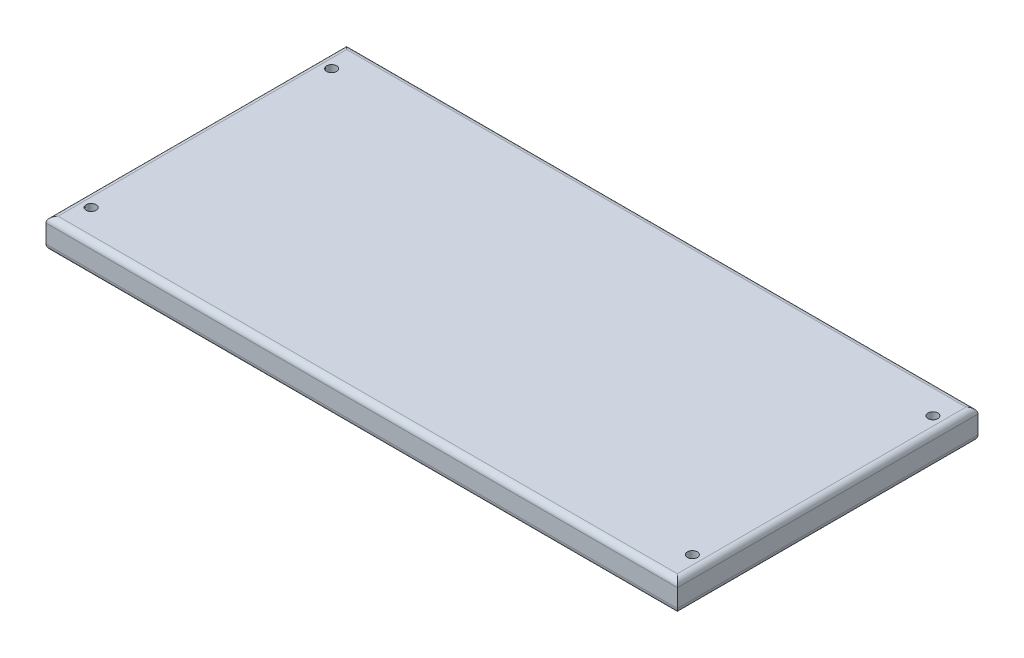
ISO-10303-21;
HEADER;
FILE_DESCRIPTION(('STEP AP214'),'2;1');
FILE_NAME('part.step','',(''),(''),'','','');
FILE_SCHEMA(('AUTOMOTIVE_DESIGN { 1 0 10303 214 1 1 1 1 }'));
ENDSEC;
DATA;
#1=APPLICATION_CONTEXT('core data for automotive mechanical design processes');
#2=APPLICATION_PROTOCOL_DEFINITION('international standard','automotive_design',2000,#1);
#3=PRODUCT_CONTEXT('',#1,'mechanical');
#4=PRODUCT('Part','Part','',(#3));
#5=PRODUCT_RELATED_PRODUCT_CATEGORY('part','',(#4));
#6=PRODUCT_DEFINITION_FORMATION('','',#4);
#7=PRODUCT_DEFINITION_CONTEXT('part definition',#1,'design');
#8=PRODUCT_DEFINITION('design','',#6,#7);
#9=PRODUCT_DEFINITION_SHAPE('','',#8);
#10=(LENGTH_UNIT() NAMED_UNIT(*) SI_UNIT(.MILLI.,.METRE.));
#11=(NAMED_UNIT(*) PLANE_ANGLE_UNIT() SI_UNIT($,.RADIAN.));
#12=(NAMED_UNIT(*) SI_UNIT($,.STERADIAN.) SOLID_ANGLE_UNIT());
#13=UNCERTAINTY_MEASURE_WITH_UNIT(LENGTH_MEASURE(1.E-05),#10,'distance_accuracy_value','');
#14=(GEOMETRIC_REPRESENTATION_CONTEXT(3) GLOBAL_UNCERTAINTY_ASSIGNED_CONTEXT((#13)) GLOBAL_UNIT_ASSIGNED_CONTEXT((#10,
#11,#12)) REPRESENTATION_CONTEXT('',''));
#15=CARTESIAN_POINT('',(0.,0.,0.));
#16=DIRECTION('',(0.,0.,1.));
#17=DIRECTION('',(1.,0.,0.));
#18=AXIS2_PLACEMENT_3D('',#15,#16,#17);
#19=CARTESIAN_POINT('',(-210.,10.,-100.));
#20=DIRECTION('',(1.,0.,0.));
#21=DIRECTION('',(0.,0.,-1.));
#22=AXIS2_PLACEMENT_3D('',#19,#20,#21);
#23=PLANE('',#22);
#24=DIRECTION('',(0.,-1.,0.));
#25=VECTOR('',#24,1.);
#26=CARTESIAN_POINT('',(-210.,10.,-100.));
#27=LINE('',#26,#25);
#28=CARTESIAN_POINT('',(-210.,8.,-100.));
#29=VERTEX_POINT('',#28);
#30=CARTESIAN_POINT('',(-210.,2.,-100.));
#31=VERTEX_POINT('',#30);
#32=EDGE_CURVE('E151',#29,#31,#27,.T.);
#33=ORIENTED_EDGE('',*,*,#32,.T.);
#34=DIRECTION('',(0.,0.,1.));
#35=VECTOR('',#34,1.);
#36=CARTESIAN_POINT('',(-210.,2.,-100.));
#37=LINE('',#36,#35);
#38=CARTESIAN_POINT('',(-210.,2.,0.));
#39=VERTEX_POINT('',#38);
#40=EDGE_CURVE('E160',#31,#39,#37,.T.);
#41=ORIENTED_EDGE('',*,*,#40,.T.);
#42=DIRECTION('',(0.,-1.,0.));
#43=VECTOR('',#42,1.);
#44=CARTESIAN_POINT('',(-210.,10.,0.));
#45=LINE('',#44,#43);
#46=CARTESIAN_POINT('',(-210.,8.,0.));
#47=VERTEX_POINT('',#46);
#48=EDGE_CURVE('E128',#47,#39,#45,.T.);
#49=ORIENTED_EDGE('',*,*,#48,.F.);
#50=DIRECTION('',(0.,0.,1.));
#51=VECTOR('',#50,1.);
#52=CARTESIAN_POINT('',(-210.,8.,-100.));
#53=LINE('',#52,#51);
#54=EDGE_CURVE('E162',#47,#29,#53,.F.);
#55=ORIENTED_EDGE('',*,*,#54,.T.);
#56=EDGE_LOOP('',(#33,#41,#49,#55));
#57=FACE_BOUND('',#56,.T.);
#58=ADVANCED_FACE('F41',(#57),#23,.F.);
#59=CARTESIAN_POINT('',(-210.,10.,0.));
#60=DIRECTION('',(0.,0.,-1.));
#61=DIRECTION('',(-1.,0.,0.));
#62=AXIS2_PLACEMENT_3D('',#59,#60,#61);
#63=PLANE('',#62);
#64=ORIENTED_EDGE('',*,*,#48,.T.);
#65=DIRECTION('',(1.,0.,0.));
#66=VECTOR('',#65,1.);
#67=CARTESIAN_POINT('',(-210.,2.,0.));
#68=LINE('',#67,#66);
#69=CARTESIAN_POINT('',(0.,2.,0.));
#70=VERTEX_POINT('',#69);
#71=EDGE_CURVE('E127',#39,#70,#68,.T.);
#72=ORIENTED_EDGE('',*,*,#71,.T.);
#73=DIRECTION('',(0.,-1.,0.));
#74=VECTOR('',#73,1.);
#75=CARTESIAN_POINT('',(0.,10.,0.));
#76=LINE('',#75,#74);
#77=CARTESIAN_POINT('',(0.,8.,0.));
#78=VERTEX_POINT('',#77);
#79=EDGE_CURVE('E110',#78,#70,#76,.T.);
#80=ORIENTED_EDGE('',*,*,#79,.F.);
#81=DIRECTION('',(1.,0.,0.));
#82=VECTOR('',#81,1.);
#83=CARTESIAN_POINT('',(-210.,8.,0.));
#84=LINE('',#83,#82);
#85=EDGE_CURVE('E124',#78,#47,#84,.F.);
#86=ORIENTED_EDGE('',*,*,#85,.T.);
#87=EDGE_LOOP('',(#64,#72,#80,#86));
#88=FACE_BOUND('',#87,.T.);
#89=ADVANCED_FACE('F123',(#88),#63,.F.);
#90=CARTESIAN_POINT('',(0.,10.,-100.));
#91=DIRECTION('',(-1.,0.,0.));
#92=DIRECTION('',(0.,0.,1.));
#93=AXIS2_PLACEMENT_3D('',#90,#91,#92);
#94=PLANE('',#93);
#95=ORIENTED_EDGE('',*,*,#79,.T.);
#96=DIRECTION('',(0.,0.,-1.));
#97=VECTOR('',#96,1.);
#98=CARTESIAN_POINT('',(0.,2.,-100.));
#99=LINE('',#98,#97);
#100=CARTESIAN_POINT('',(0.,2.,-100.));
#101=VERTEX_POINT('',#100);
#102=EDGE_CURVE('E116',#70,#101,#99,.T.);
#103=ORIENTED_EDGE('',*,*,#102,.T.);
#104=DIRECTION('',(0.,-1.,0.));
#105=VECTOR('',#104,1.);
#106=CARTESIAN_POINT('',(0.,10.,-100.));
#107=LINE('',#106,#105);
#108=CARTESIAN_POINT('',(0.,8.,-100.));
#109=VERTEX_POINT('',#108);
#110=EDGE_CURVE('E112',#109,#101,#107,.T.);
#111=ORIENTED_EDGE('',*,*,#110,.F.);
#112=DIRECTION('',(0.,0.,-1.));
#113=VECTOR('',#112,1.);
#114=CARTESIAN_POINT('',(0.,8.,0.));
#115=LINE('',#114,#113);
#116=EDGE_CURVE('E107',#109,#78,#115,.F.);
#117=ORIENTED_EDGE('',*,*,#116,.T.);
#118=EDGE_LOOP('',(#95,#103,#111,#117));
#119=FACE_BOUND('',#118,.T.);
#120=ADVANCED_FACE('F109',(#119),#94,.F.);
#121=CARTESIAN_POINT('',(-210.,10.,-100.));
#122=DIRECTION('',(0.,0.,1.));
#123=DIRECTION('',(1.,0.,0.));
#124=AXIS2_PLACEMENT_3D('',#121,#122,#123);
#125=PLANE('',#124);
#126=ORIENTED_EDGE('',*,*,#110,.T.);
#127=DIRECTION('',(-1.,0.,0.));
#128=VECTOR('',#127,1.);
#129=CARTESIAN_POINT('',(-210.,2.,-100.));
#130=LINE('',#129,#128);
#131=EDGE_CURVE('E164',#101,#31,#130,.T.);
#132=ORIENTED_EDGE('',*,*,#131,.T.);
#133=ORIENTED_EDGE('',*,*,#32,.F.);
#134=DIRECTION('',(-1.,0.,0.));
#135=VECTOR('',#134,1.);
#136=CARTESIAN_POINT('',(0.,8.,-100.));
#137=LINE('',#136,#135);
#138=EDGE_CURVE('E166',#29,#109,#137,.F.);
#139=ORIENTED_EDGE('',*,*,#138,.T.);
#140=EDGE_LOOP('',(#126,#132,#133,#139));
#141=FACE_BOUND('',#140,.T.);
#142=ADVANCED_FACE('F212',(#141),#125,.F.);
#143=CARTESIAN_POINT('',(0.,10.,0.));
#144=DIRECTION('',(0.,1.,0.));
#145=DIRECTION('',(0.,0.,1.));
#146=AXIS2_PLACEMENT_3D('',#143,#144,#145);
#147=PLANE('',#146);
#148=CARTESIAN_POINT('',(-4.99999999999995,10.,-9.99999999999998));
#149=DIRECTION('',(0.,1.,0.));
#150=DIRECTION('',(0.,0.,1.));
#151=AXIS2_PLACEMENT_3D('',#148,#149,#150);
#152=CIRCLE('',#151,1.65000000000001);
#153=CARTESIAN_POINT('',(-4.99999999999995,10.,-8.34999999999997));
#154=VERTEX_POINT('',#153);
#155=EDGE_CURVE('E191',#154,#154,#152,.T.);
#156=ORIENTED_EDGE('',*,*,#155,.F.);
#157=EDGE_LOOP('',(#156));
#158=FACE_BOUND('',#157,.T.);
#159=CARTESIAN_POINT('',(-4.99999999999995,10.,-90.));
#160=DIRECTION('',(0.,1.,0.));
#161=DIRECTION('',(0.,0.,1.));
#162=AXIS2_PLACEMENT_3D('',#159,#160,#161);
#163=CIRCLE('',#162,1.65000000000001);
#164=CARTESIAN_POINT('',(-4.99999999999995,10.,-88.35));
#165=VERTEX_POINT('',#164);
#166=EDGE_CURVE('E197',#165,#165,#163,.T.);
#167=ORIENTED_EDGE('',*,*,#166,.F.);
#168=EDGE_LOOP('',(#167));
#169=FACE_BOUND('',#168,.T.);
#170=CARTESIAN_POINT('',(-205.,10.,-90.));
#171=DIRECTION('',(0.,1.,0.));
#172=DIRECTION('',(0.,0.,1.));
#173=AXIS2_PLACEMENT_3D('',#170,#171,#172);
#174=CIRCLE('',#173,1.64999999999999);
#175=CARTESIAN_POINT('',(-205.,10.,-88.35));
#176=VERTEX_POINT('',#175);
#177=EDGE_CURVE('E185',#176,#176,#174,.T.);
#178=ORIENTED_EDGE('',*,*,#177,.F.);
#179=EDGE_LOOP('',(#178));
#180=FACE_BOUND('',#179,.T.);
#181=CARTESIAN_POINT('',(-205.,10.,-9.99999999999998));
#182=DIRECTION('',(0.,1.,0.));
#183=DIRECTION('',(0.,0.,1.));
#184=AXIS2_PLACEMENT_3D('',#181,#182,#183);
#185=CIRCLE('',#184,1.65000000000002);
#186=CARTESIAN_POINT('',(-205.,10.,-8.34999999999997));
#187=VERTEX_POINT('',#186);
#188=EDGE_CURVE('E182',#187,#187,#185,.T.);
#189=ORIENTED_EDGE('',*,*,#188,.F.);
#190=EDGE_LOOP('',(#189));
#191=FACE_BOUND('',#190,.T.);
#192=DIRECTION('',(0.,0.,-1.));
#193=VECTOR('',#192,1.);
#194=CARTESIAN_POINT('',(-2.,10.,-100.));
#195=LINE('',#194,#193);
#196=CARTESIAN_POINT('',(-2.,10.,-2.));
#197=VERTEX_POINT('',#196);
#198=CARTESIAN_POINT('',(-2.,10.,-98.));
#199=VERTEX_POINT('',#198);
#200=EDGE_CURVE('E50',#197,#199,#195,.T.);
#201=ORIENTED_EDGE('',*,*,#200,.T.);
#202=DIRECTION('',(-1.,0.,0.));
#203=VECTOR('',#202,1.);
#204=CARTESIAN_POINT('',(-210.,10.,-98.));
#205=LINE('',#204,#203);
#206=CARTESIAN_POINT('',(-208.,10.,-98.));
#207=VERTEX_POINT('',#206);
#208=EDGE_CURVE('E11',#199,#207,#205,.T.);
#209=ORIENTED_EDGE('',*,*,#208,.T.);
#210=DIRECTION('',(0.,0.,1.));
#211=VECTOR('',#210,1.);
#212=CARTESIAN_POINT('',(-208.,10.,0.));
#213=LINE('',#212,#211);
#214=CARTESIAN_POINT('',(-208.,10.,-2.));
#215=VERTEX_POINT('',#214);
#216=EDGE_CURVE('E158',#207,#215,#213,.T.);
#217=ORIENTED_EDGE('',*,*,#216,.T.);
#218=DIRECTION('',(1.,0.,0.));
#219=VECTOR('',#218,1.);
#220=CARTESIAN_POINT('',(0.,10.,-2.));
#221=LINE('',#220,#219);
#222=EDGE_CURVE('E61',#215,#197,#221,.T.);
#223=ORIENTED_EDGE('',*,*,#222,.T.);
#224=EDGE_LOOP('',(#201,#209,#217,#223));
#225=FACE_BOUND('',#224,.T.);
#226=ADVANCED_FACE('F208',(#158,#169,#180,#191,#225),#147,.T.);
#227=CARTESIAN_POINT('',(0.,0.,0.));
#228=DIRECTION('',(0.,1.,0.));
#229=DIRECTION('',(0.,0.,1.));
#230=AXIS2_PLACEMENT_3D('',#227,#228,#229);
#231=PLANE('',#230);
#232=CARTESIAN_POINT('',(-4.99999999999995,0.,-9.99999999999998));
#233=DIRECTION('',(0.,1.,0.));
#234=DIRECTION('',(0.,0.,1.));
#235=AXIS2_PLACEMENT_3D('',#232,#233,#234);
#236=CIRCLE('',#235,1.65000000000001);
#237=CARTESIAN_POINT('',(-4.99999999999995,0.,-8.34999999999997));
#238=VERTEX_POINT('',#237);
#239=EDGE_CURVE('E188',#238,#238,#236,.T.);
#240=ORIENTED_EDGE('',*,*,#239,.T.);
#241=EDGE_LOOP('',(#240));
#242=FACE_BOUND('',#241,.T.);
#243=CARTESIAN_POINT('',(-4.99999999999995,0.,-90.));
#244=DIRECTION('',(0.,1.,0.));
#245=DIRECTION('',(0.,0.,1.));
#246=AXIS2_PLACEMENT_3D('',#243,#244,#245);
#247=CIRCLE('',#246,1.65000000000001);
#248=CARTESIAN_POINT('',(-4.99999999999995,0.,-88.35));
#249=VERTEX_POINT('',#248);
#250=EDGE_CURVE('E194',#249,#249,#247,.T.);
#251=ORIENTED_EDGE('',*,*,#250,.T.);
#252=EDGE_LOOP('',(#251));
#253=FACE_BOUND('',#252,.T.);
#254=CARTESIAN_POINT('',(-205.,0.,-90.));
#255=DIRECTION('',(0.,1.,0.));
#256=DIRECTION('',(0.,0.,1.));
#257=AXIS2_PLACEMENT_3D('',#254,#255,#256);
#258=CIRCLE('',#257,1.64999999999999);
#259=CARTESIAN_POINT('',(-205.,0.,-88.35));
#260=VERTEX_POINT('',#259);
#261=EDGE_CURVE('E200',#260,#260,#258,.T.);
#262=ORIENTED_EDGE('',*,*,#261,.T.);
#263=EDGE_LOOP('',(#262));
#264=FACE_BOUND('',#263,.T.);
#265=CARTESIAN_POINT('',(-205.,0.,-9.99999999999998));
#266=DIRECTION('',(0.,1.,0.));
#267=DIRECTION('',(0.,0.,1.));
#268=AXIS2_PLACEMENT_3D('',#265,#266,#267);
#269=CIRCLE('',#268,1.65000000000002);
#270=CARTESIAN_POINT('',(-205.,0.,-8.34999999999997));
#271=VERTEX_POINT('',#270);
#272=EDGE_CURVE('E147',#271,#271,#269,.T.);
#273=ORIENTED_EDGE('',*,*,#272,.T.);
#274=EDGE_LOOP('',(#273));
#275=FACE_BOUND('',#274,.T.);
#276=DIRECTION('',(0.,0.,-1.));
#277=VECTOR('',#276,1.);
#278=CARTESIAN_POINT('',(-2.,0.,0.));
#279=LINE('',#278,#277);
#280=CARTESIAN_POINT('',(-2.,0.,-98.));
#281=VERTEX_POINT('',#280);
#282=CARTESIAN_POINT('',(-2.,0.,-2.));
#283=VERTEX_POINT('',#282);
#284=EDGE_CURVE('E171',#281,#283,#279,.F.);
#285=ORIENTED_EDGE('',*,*,#284,.T.);
#286=DIRECTION('',(1.,0.,0.));
#287=VECTOR('',#286,1.);
#288=CARTESIAN_POINT('',(0.,0.,-2.));
#289=LINE('',#288,#287);
#290=CARTESIAN_POINT('',(-208.,0.,-2.));
#291=VERTEX_POINT('',#290);
#292=EDGE_CURVE('E117',#283,#291,#289,.F.);
#293=ORIENTED_EDGE('',*,*,#292,.T.);
#294=DIRECTION('',(0.,0.,1.));
#295=VECTOR('',#294,1.);
#296=CARTESIAN_POINT('',(-208.,0.,0.));
#297=LINE('',#296,#295);
#298=CARTESIAN_POINT('',(-208.,0.,-98.));
#299=VERTEX_POINT('',#298);
#300=EDGE_CURVE('E175',#291,#299,#297,.F.);
#301=ORIENTED_EDGE('',*,*,#300,.T.);
#302=DIRECTION('',(-1.,0.,0.));
#303=VECTOR('',#302,1.);
#304=CARTESIAN_POINT('',(0.,0.,-98.));
#305=LINE('',#304,#303);
#306=EDGE_CURVE('E173',#299,#281,#305,.F.);
#307=ORIENTED_EDGE('',*,*,#306,.T.);
#308=EDGE_LOOP('',(#285,#293,#301,#307));
#309=FACE_BOUND('',#308,.T.);
#310=ADVANCED_FACE('F211',(#242,#253,#264,#275,#309),#231,.F.);
#311=CARTESIAN_POINT('',(-210.,2.,-98.));
#312=DIRECTION('',(-1.,0.,0.));
#313=DIRECTION('',(0.,0.,1.));
#314=AXIS2_PLACEMENT_3D('',#311,#312,#313);
#315=CYLINDRICAL_SURFACE('',#314,2.);
#316=CARTESIAN_POINT('',(-2.,2.,-98.));
#317=DIRECTION('',(-0.707106781186548,0.,-0.707106781186547));
#318=DIRECTION('',(-0.707106781186547,0.,0.707106781186548));
#319=AXIS2_PLACEMENT_3D('',#316,#317,#318);
#320=ELLIPSE('',#319,2.82842712474619,2.);
#321=EDGE_CURVE('E152',#281,#101,#320,.F.);
#322=ORIENTED_EDGE('',*,*,#321,.F.);
#323=ORIENTED_EDGE('',*,*,#306,.F.);
#324=CARTESIAN_POINT('',(-208.,2.,-98.));
#325=DIRECTION('',(-0.707106781186547,0.,0.707106781186548));
#326=DIRECTION('',(0.707106781186548,0.,0.707106781186547));
#327=AXIS2_PLACEMENT_3D('',#324,#325,#326);
#328=ELLIPSE('',#327,2.82842712474619,2.);
#329=EDGE_CURVE('E148',#31,#299,#328,.T.);
#330=ORIENTED_EDGE('',*,*,#329,.F.);
#331=ORIENTED_EDGE('',*,*,#131,.F.);
#332=EDGE_LOOP('',(#322,#323,#330,#331));
#333=FACE_BOUND('',#332,.T.);
#334=ADVANCED_FACE('F255',(#333),#315,.T.);
#335=CARTESIAN_POINT('',(-208.,2.,-100.));
#336=DIRECTION('',(0.,0.,1.));
#337=DIRECTION('',(1.,0.,0.));
#338=AXIS2_PLACEMENT_3D('',#335,#336,#337);
#339=CYLINDRICAL_SURFACE('',#338,2.);
#340=ORIENTED_EDGE('',*,*,#329,.T.);
#341=ORIENTED_EDGE('',*,*,#300,.F.);
#342=CARTESIAN_POINT('',(-208.,2.,-2.));
#343=DIRECTION('',(0.707106781186547,0.,0.707106781186547));
#344=DIRECTION('',(-0.707106781186547,0.,0.707106781186547));
#345=AXIS2_PLACEMENT_3D('',#342,#343,#344);
#346=ELLIPSE('',#345,2.82842712474619,2.);
#347=EDGE_CURVE('E138',#39,#291,#346,.T.);
#348=ORIENTED_EDGE('',*,*,#347,.F.);
#349=ORIENTED_EDGE('',*,*,#40,.F.);
#350=EDGE_LOOP('',(#340,#341,#348,#349));
#351=FACE_BOUND('',#350,.T.);
#352=ADVANCED_FACE('F251',(#351),#339,.T.);
#353=CARTESIAN_POINT('',(-2.,2.,-100.));
#354=DIRECTION('',(0.,0.,-1.));
#355=DIRECTION('',(-1.,0.,0.));
#356=AXIS2_PLACEMENT_3D('',#353,#354,#355);
#357=CYLINDRICAL_SURFACE('',#356,2.);
#358=ORIENTED_EDGE('',*,*,#321,.T.);
#359=ORIENTED_EDGE('',*,*,#102,.F.);
#360=CARTESIAN_POINT('',(-2.,2.,-2.));
#361=DIRECTION('',(0.707106781186547,0.,-0.707106781186547));
#362=DIRECTION('',(-0.707106781186547,0.,-0.707106781186547));
#363=AXIS2_PLACEMENT_3D('',#360,#361,#362);
#364=ELLIPSE('',#363,2.82842712474619,2.);
#365=EDGE_CURVE('E137',#283,#70,#364,.F.);
#366=ORIENTED_EDGE('',*,*,#365,.F.);
#367=ORIENTED_EDGE('',*,*,#284,.F.);
#368=EDGE_LOOP('',(#358,#359,#366,#367));
#369=FACE_BOUND('',#368,.T.);
#370=ADVANCED_FACE('F247',(#369),#357,.T.);
#371=CARTESIAN_POINT('',(-210.,2.,-2.));
#372=DIRECTION('',(1.,0.,0.));
#373=DIRECTION('',(0.,0.,-1.));
#374=AXIS2_PLACEMENT_3D('',#371,#372,#373);
#375=CYLINDRICAL_SURFACE('',#374,2.);
#376=ORIENTED_EDGE('',*,*,#347,.T.);
#377=ORIENTED_EDGE('',*,*,#292,.F.);
#378=ORIENTED_EDGE('',*,*,#365,.T.);
#379=ORIENTED_EDGE('',*,*,#71,.F.);
#380=EDGE_LOOP('',(#376,#377,#378,#379));
#381=FACE_BOUND('',#380,.T.);
#382=ADVANCED_FACE('F244',(#381),#375,.T.);
#383=CARTESIAN_POINT('',(0.,8.,-2.));
#384=DIRECTION('',(-1.,0.,0.));
#385=DIRECTION('',(0.,0.,1.));
#386=AXIS2_PLACEMENT_3D('',#383,#384,#385);
#387=CYLINDRICAL_SURFACE('',#386,2.);
#388=CARTESIAN_POINT('',(-208.,8.,-2.));
#389=DIRECTION('',(-0.707106781186547,0.,-0.707106781186547));
#390=DIRECTION('',(0.707106781186547,0.,-0.707106781186547));
#391=AXIS2_PLACEMENT_3D('',#388,#389,#390);
#392=ELLIPSE('',#391,2.82842712474619,2.);
#393=EDGE_CURVE('E133',#47,#215,#392,.T.);
#394=ORIENTED_EDGE('',*,*,#393,.F.);
#395=ORIENTED_EDGE('',*,*,#85,.F.);
#396=CARTESIAN_POINT('',(-2.,8.,-2.));
#397=DIRECTION('',(-0.707106781186547,0.,0.707106781186547));
#398=DIRECTION('',(-0.707106781186547,0.,-0.707106781186547));
#399=AXIS2_PLACEMENT_3D('',#396,#397,#398);
#400=ELLIPSE('',#399,2.82842712474619,2.);
#401=EDGE_CURVE('E45',#197,#78,#400,.F.);
#402=ORIENTED_EDGE('',*,*,#401,.F.);
#403=ORIENTED_EDGE('',*,*,#222,.F.);
#404=EDGE_LOOP('',(#394,#395,#402,#403));
#405=FACE_BOUND('',#404,.T.);
#406=ADVANCED_FACE('F43',(#405),#387,.T.);
#407=CARTESIAN_POINT('',(-2.,8.,0.));
#408=DIRECTION('',(0.,0.,1.));
#409=DIRECTION('',(1.,0.,0.));
#410=AXIS2_PLACEMENT_3D('',#407,#408,#409);
#411=CYLINDRICAL_SURFACE('',#410,2.);
#412=ORIENTED_EDGE('',*,*,#401,.T.);
#413=ORIENTED_EDGE('',*,*,#116,.F.);
#414=CARTESIAN_POINT('',(-2.,8.,-98.));
#415=DIRECTION('',(0.707106781186548,0.,0.707106781186547));
#416=DIRECTION('',(-0.707106781186547,0.,0.707106781186548));
#417=AXIS2_PLACEMENT_3D('',#414,#415,#416);
#418=ELLIPSE('',#417,2.82842712474619,2.);
#419=EDGE_CURVE('E140',#199,#109,#418,.F.);
#420=ORIENTED_EDGE('',*,*,#419,.F.);
#421=ORIENTED_EDGE('',*,*,#200,.F.);
#422=EDGE_LOOP('',(#412,#413,#420,#421));
#423=FACE_BOUND('',#422,.T.);
#424=ADVANCED_FACE('F136',(#423),#411,.T.);
#425=CARTESIAN_POINT('',(-208.,8.,0.));
#426=DIRECTION('',(0.,0.,-1.));
#427=DIRECTION('',(-1.,0.,0.));
#428=AXIS2_PLACEMENT_3D('',#425,#426,#427);
#429=CYLINDRICAL_SURFACE('',#428,2.);
#430=ORIENTED_EDGE('',*,*,#393,.T.);
#431=ORIENTED_EDGE('',*,*,#216,.F.);
#432=CARTESIAN_POINT('',(-208.,8.,-98.));
#433=DIRECTION('',(0.707106781186547,0.,-0.707106781186548));
#434=DIRECTION('',(-0.707106781186548,0.,-0.707106781186547));
#435=AXIS2_PLACEMENT_3D('',#432,#433,#434);
#436=ELLIPSE('',#435,2.82842712474619,2.);
#437=EDGE_CURVE('E143',#29,#207,#436,.T.);
#438=ORIENTED_EDGE('',*,*,#437,.F.);
#439=ORIENTED_EDGE('',*,*,#54,.F.);
#440=EDGE_LOOP('',(#430,#431,#438,#439));
#441=FACE_BOUND('',#440,.T.);
#442=ADVANCED_FACE('F230',(#441),#429,.T.);
#443=CARTESIAN_POINT('',(0.,8.,-98.));
#444=DIRECTION('',(1.,0.,0.));
#445=DIRECTION('',(0.,0.,-1.));
#446=AXIS2_PLACEMENT_3D('',#443,#444,#445);
#447=CYLINDRICAL_SURFACE('',#446,2.);
#448=ORIENTED_EDGE('',*,*,#419,.T.);
#449=ORIENTED_EDGE('',*,*,#138,.F.);
#450=ORIENTED_EDGE('',*,*,#437,.T.);
#451=ORIENTED_EDGE('',*,*,#208,.F.);
#452=EDGE_LOOP('',(#448,#449,#450,#451));
#453=FACE_BOUND('',#452,.T.);
#454=ADVANCED_FACE('F219',(#453),#447,.T.);
#455=CARTESIAN_POINT('',(-205.,0.,-9.99999999999998));
#456=DIRECTION('',(0.,1.,0.));
#457=DIRECTION('',(0.,0.,1.));
#458=AXIS2_PLACEMENT_3D('',#455,#456,#457);
#459=CYLINDRICAL_SURFACE('',#458,1.65000000000002);
#460=ORIENTED_EDGE('',*,*,#272,.F.);
#461=EDGE_LOOP('',(#460));
#462=FACE_BOUND('',#461,.T.);
#463=ORIENTED_EDGE('',*,*,#188,.T.);
#464=EDGE_LOOP('',(#463));
#465=FACE_BOUND('',#464,.T.);
#466=ADVANCED_FACE('F217',(#462,#465),#459,.F.);
#467=CARTESIAN_POINT('',(-205.,0.,-90.));
#468=DIRECTION('',(0.,1.,0.));
#469=DIRECTION('',(0.,0.,1.));
#470=AXIS2_PLACEMENT_3D('',#467,#468,#469);
#471=CYLINDRICAL_SURFACE('',#470,1.64999999999999);
#472=ORIENTED_EDGE('',*,*,#261,.F.);
#473=EDGE_LOOP('',(#472));
#474=FACE_BOUND('',#473,.T.);
#475=ORIENTED_EDGE('',*,*,#177,.T.);
#476=EDGE_LOOP('',(#475));
#477=FACE_BOUND('',#476,.T.);
#478=ADVANCED_FACE('F206',(#474,#477),#471,.F.);
#479=CARTESIAN_POINT('',(-4.99999999999995,0.,-90.));
#480=DIRECTION('',(0.,1.,0.));
#481=DIRECTION('',(0.,0.,1.));
#482=AXIS2_PLACEMENT_3D('',#479,#480,#481);
#483=CYLINDRICAL_SURFACE('',#482,1.65000000000001);
#484=ORIENTED_EDGE('',*,*,#250,.F.);
#485=EDGE_LOOP('',(#484));
#486=FACE_BOUND('',#485,.T.);
#487=ORIENTED_EDGE('',*,*,#166,.T.);
#488=EDGE_LOOP('',(#487));
#489=FACE_BOUND('',#488,.T.);
#490=ADVANCED_FACE('F226',(#486,#489),#483,.F.);
#491=CARTESIAN_POINT('',(-4.99999999999995,0.,-9.99999999999998));
#492=DIRECTION('',(0.,1.,0.));
#493=DIRECTION('',(0.,0.,1.));
#494=AXIS2_PLACEMENT_3D('',#491,#492,#493);
#495=CYLINDRICAL_SURFACE('',#494,1.65000000000001);
#496=ORIENTED_EDGE('',*,*,#239,.F.);
#497=EDGE_LOOP('',(#496));
#498=FACE_BOUND('',#497,.T.);
#499=ORIENTED_EDGE('',*,*,#155,.T.);
#500=EDGE_LOOP('',(#499));
#501=FACE_BOUND('',#500,.T.);
#502=ADVANCED_FACE('F361',(#498,#501),#495,.F.);
#503=CLOSED_SHELL('',(#58,#89,#120,#142,#226,#310,#334,#352,#370,#382,#406,#424,#442,#454,#466,
#478,#490,#502));
#504=MANIFOLD_SOLID_BREP('B2',#503);
#505=ADVANCED_BREP_SHAPE_REPRESENTATION('',(#18,#504),#14);
#506=SHAPE_DEFINITION_REPRESENTATION(#9,#505);
ENDSEC;
END-ISO-10303-21;
